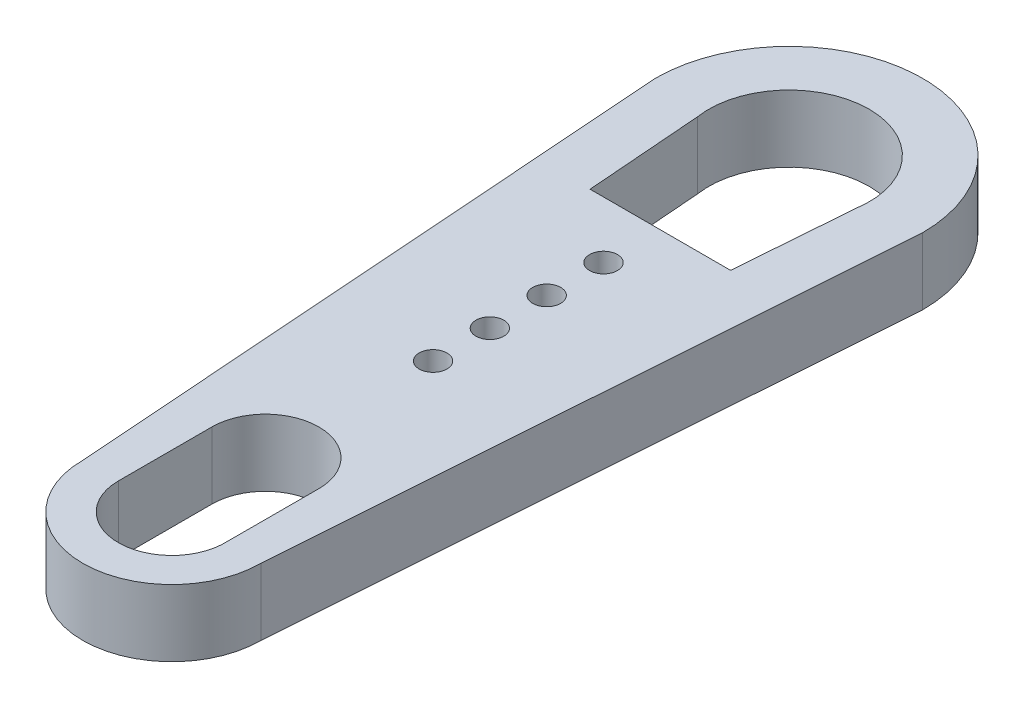
ISO-10303-21;
HEADER;
FILE_DESCRIPTION(('STEP AP214'),'2;1');
FILE_NAME('part.step','',(''),(''),'','','');
FILE_SCHEMA(('AUTOMOTIVE_DESIGN { 1 0 10303 214 1 1 1 1 }'));
ENDSEC;
DATA;
#1=APPLICATION_CONTEXT('core data for automotive mechanical design processes');
#2=APPLICATION_PROTOCOL_DEFINITION('international standard','automotive_design',2000,#1);
#3=PRODUCT_CONTEXT('',#1,'mechanical');
#4=PRODUCT('Part','Part','',(#3));
#5=PRODUCT_RELATED_PRODUCT_CATEGORY('part','',(#4));
#6=PRODUCT_DEFINITION_FORMATION('','',#4);
#7=PRODUCT_DEFINITION_CONTEXT('part definition',#1,'design');
#8=PRODUCT_DEFINITION('design','',#6,#7);
#9=PRODUCT_DEFINITION_SHAPE('','',#8);
#10=(LENGTH_UNIT() NAMED_UNIT(*) SI_UNIT(.MILLI.,.METRE.));
#11=(NAMED_UNIT(*) PLANE_ANGLE_UNIT() SI_UNIT($,.RADIAN.));
#12=(NAMED_UNIT(*) SI_UNIT($,.STERADIAN.) SOLID_ANGLE_UNIT());
#13=UNCERTAINTY_MEASURE_WITH_UNIT(LENGTH_MEASURE(1.E-05),#10,'distance_accuracy_value','');
#14=(GEOMETRIC_REPRESENTATION_CONTEXT(3) GLOBAL_UNCERTAINTY_ASSIGNED_CONTEXT((#13)) GLOBAL_UNIT_ASSIGNED_CONTEXT((#10,
#11,#12)) REPRESENTATION_CONTEXT('',''));
#15=CARTESIAN_POINT('',(0.,0.,0.));
#16=DIRECTION('',(0.,0.,1.));
#17=DIRECTION('',(1.,0.,0.));
#18=AXIS2_PLACEMENT_3D('',#15,#16,#17);
#19=CARTESIAN_POINT('',(0.530625446326115,3.,4.15892305549947));
#20=DIRECTION('',(0.,-1.,0.));
#21=DIRECTION('',(0.,0.,-1.));
#22=AXIS2_PLACEMENT_3D('',#19,#20,#21);
#23=CYLINDRICAL_SURFACE('',#22,2.4);
#24=CARTESIAN_POINT('',(0.530625446326115,0.,4.15892305549947));
#25=DIRECTION('',(0.,1.,0.));
#26=DIRECTION('',(0.,0.,1.));
#27=AXIS2_PLACEMENT_3D('',#24,#25,#26);
#28=CIRCLE('',#27,2.4);
#29=CARTESIAN_POINT('',(-1.86937455367389,0.,4.15892305549947));
#30=VERTEX_POINT('',#29);
#31=CARTESIAN_POINT('',(2.92734340542614,0.,4.0334518455452));
#32=VERTEX_POINT('',#31);
#33=EDGE_CURVE('E196',#30,#32,#28,.T.);
#34=ORIENTED_EDGE('',*,*,#33,.F.);
#35=DIRECTION('',(0.,-1.,0.));
#36=VECTOR('',#35,1.);
#37=CARTESIAN_POINT('',(-1.86937455367389,3.,4.15892305549947));
#38=LINE('',#37,#36);
#39=CARTESIAN_POINT('',(-1.86937455367389,3.,4.15892305549947));
#40=VERTEX_POINT('',#39);
#41=EDGE_CURVE('E11',#40,#30,#38,.T.);
#42=ORIENTED_EDGE('',*,*,#41,.F.);
#43=CARTESIAN_POINT('',(0.530625446326115,3.,4.15892305549947));
#44=DIRECTION('',(0.,1.,0.));
#45=DIRECTION('',(0.,0.,1.));
#46=AXIS2_PLACEMENT_3D('',#43,#44,#45);
#47=CIRCLE('',#46,2.4);
#48=CARTESIAN_POINT('',(2.92734340542614,3.,4.0334518455452));
#49=VERTEX_POINT('',#48);
#50=EDGE_CURVE('E153',#40,#49,#47,.T.);
#51=ORIENTED_EDGE('',*,*,#50,.T.);
#52=DIRECTION('',(0.,-1.,0.));
#53=VECTOR('',#52,1.);
#54=CARTESIAN_POINT('',(2.92734340542614,3.,4.0334518455452));
#55=LINE('',#54,#53);
#56=EDGE_CURVE('E106',#49,#32,#55,.T.);
#57=ORIENTED_EDGE('',*,*,#56,.T.);
#58=EDGE_LOOP('',(#34,#42,#51,#57));
#59=FACE_BOUND('',#58,.T.);
#60=ADVANCED_FACE('F41',(#59),#23,.F.);
#61=CARTESIAN_POINT('',(-1.86937455367389,3.,0.));
#62=DIRECTION('',(1.,0.,0.));
#63=DIRECTION('',(0.,0.,-1.));
#64=AXIS2_PLACEMENT_3D('',#61,#62,#63);
#65=PLANE('',#64);
#66=DIRECTION('',(0.,0.,1.));
#67=VECTOR('',#66,1.);
#68=CARTESIAN_POINT('',(-1.86937455367389,0.,0.));
#69=LINE('',#68,#67);
#70=CARTESIAN_POINT('',(-1.86937455367389,0.,-0.0410769445005307));
#71=VERTEX_POINT('',#70);
#72=EDGE_CURVE('E145',#71,#30,#69,.T.);
#73=ORIENTED_EDGE('',*,*,#72,.F.);
#74=DIRECTION('',(0.,-1.,0.));
#75=VECTOR('',#74,1.);
#76=CARTESIAN_POINT('',(-1.86937455367389,3.,-0.0410769445005307));
#77=LINE('',#76,#75);
#78=CARTESIAN_POINT('',(-1.86937455367389,3.,-0.0410769445005307));
#79=VERTEX_POINT('',#78);
#80=EDGE_CURVE('E51',#79,#71,#77,.T.);
#81=ORIENTED_EDGE('',*,*,#80,.F.);
#82=DIRECTION('',(0.,0.,1.));
#83=VECTOR('',#82,1.);
#84=CARTESIAN_POINT('',(-1.86937455367389,3.,0.));
#85=LINE('',#84,#83);
#86=EDGE_CURVE('E143',#79,#40,#85,.T.);
#87=ORIENTED_EDGE('',*,*,#86,.T.);
#88=ORIENTED_EDGE('',*,*,#41,.T.);
#89=EDGE_LOOP('',(#73,#81,#87,#88));
#90=FACE_BOUND('',#89,.T.);
#91=ADVANCED_FACE('F142',(#90),#65,.T.);
#92=CARTESIAN_POINT('',(0.530625446326113,3.,-0.0410769445005307));
#93=DIRECTION('',(0.,-1.,0.));
#94=DIRECTION('',(0.,0.,-1.));
#95=AXIS2_PLACEMENT_3D('',#92,#93,#94);
#96=CYLINDRICAL_SURFACE('',#95,2.4);
#97=CARTESIAN_POINT('',(0.530625446326113,0.,-0.0410769445005307));
#98=DIRECTION('',(0.,1.,0.));
#99=DIRECTION('',(0.,0.,1.));
#100=AXIS2_PLACEMENT_3D('',#97,#98,#99);
#101=CIRCLE('',#100,2.4);
#102=CARTESIAN_POINT('',(2.93062544632611,0.,-0.0410769445005307));
#103=VERTEX_POINT('',#102);
#104=EDGE_CURVE('E200',#103,#71,#101,.T.);
#105=ORIENTED_EDGE('',*,*,#104,.F.);
#106=DIRECTION('',(0.,-1.,0.));
#107=VECTOR('',#106,1.);
#108=CARTESIAN_POINT('',(2.93062544632611,3.,-0.0410769445005307));
#109=LINE('',#108,#107);
#110=CARTESIAN_POINT('',(2.93062544632611,3.,-0.0410769445005307));
#111=VERTEX_POINT('',#110);
#112=EDGE_CURVE('E99',#111,#103,#109,.T.);
#113=ORIENTED_EDGE('',*,*,#112,.F.);
#114=CARTESIAN_POINT('',(0.530625446326113,3.,-0.0410769445005307));
#115=DIRECTION('',(0.,1.,0.));
#116=DIRECTION('',(0.,0.,1.));
#117=AXIS2_PLACEMENT_3D('',#114,#115,#116);
#118=CIRCLE('',#117,2.4);
#119=EDGE_CURVE('E152',#111,#79,#118,.T.);
#120=ORIENTED_EDGE('',*,*,#119,.T.);
#121=ORIENTED_EDGE('',*,*,#80,.T.);
#122=EDGE_LOOP('',(#105,#113,#120,#121));
#123=FACE_BOUND('',#122,.T.);
#124=ADVANCED_FACE('F155',(#123),#96,.F.);
#125=CARTESIAN_POINT('',(-3.75010792122691,3.,0.27076591489003));
#126=DIRECTION('',(0.997403570895242,0.,-0.0720146982595844));
#127=DIRECTION('',(-0.0720146982595844,0.,-0.997403570895243));
#128=AXIS2_PLACEMENT_3D('',#125,#126,#127);
#129=PLANE('',#128);
#130=DIRECTION('',(0.0720146982595844,0.,0.997403570895243));
#131=VECTOR('',#130,1.);
#132=CARTESIAN_POINT('',(-3.75010792122691,0.,0.27076591489003));
#133=LINE('',#132,#131);
#134=CARTESIAN_POINT('',(-5.46937455367389,0.,-23.5410769445006));
#135=VERTEX_POINT('',#134);
#136=CARTESIAN_POINT('',(-3.46937455367389,0.,4.15892305549947));
#137=VERTEX_POINT('',#136);
#138=EDGE_CURVE('E185',#135,#137,#133,.T.);
#139=ORIENTED_EDGE('',*,*,#138,.T.);
#140=DIRECTION('',(0.,-1.,0.));
#141=VECTOR('',#140,1.);
#142=CARTESIAN_POINT('',(-3.46937455367389,3.,4.15892305549947));
#143=LINE('',#142,#141);
#144=CARTESIAN_POINT('',(-3.46937455367389,3.,4.15892305549947));
#145=VERTEX_POINT('',#144);
#146=EDGE_CURVE('E206',#145,#137,#143,.T.);
#147=ORIENTED_EDGE('',*,*,#146,.F.);
#148=DIRECTION('',(0.0720146982595844,0.,0.997403570895243));
#149=VECTOR('',#148,1.);
#150=CARTESIAN_POINT('',(-3.75010792122691,3.,0.27076591489003));
#151=LINE('',#150,#149);
#152=CARTESIAN_POINT('',(-5.46937455367389,3.,-23.5410769445006));
#153=VERTEX_POINT('',#152);
#154=EDGE_CURVE('E487',#153,#145,#151,.T.);
#155=ORIENTED_EDGE('',*,*,#154,.F.);
#156=DIRECTION('',(0.,-1.,0.));
#157=VECTOR('',#156,1.);
#158=CARTESIAN_POINT('',(-5.46937455367389,3.,-23.5410769445006));
#159=LINE('',#158,#157);
#160=EDGE_CURVE('E208',#153,#135,#159,.T.);
#161=ORIENTED_EDGE('',*,*,#160,.T.);
#162=EDGE_LOOP('',(#139,#147,#155,#161));
#163=FACE_BOUND('',#162,.T.);
#164=ADVANCED_FACE('F266',(#163),#129,.F.);
#165=CARTESIAN_POINT('',(0.530625446326115,3.,4.15892305549947));
#166=DIRECTION('',(0.,-1.,0.));
#167=DIRECTION('',(0.,0.,-1.));
#168=AXIS2_PLACEMENT_3D('',#165,#166,#167);
#169=CYLINDRICAL_SURFACE('',#168,4.);
#170=CARTESIAN_POINT('',(0.530625446326115,0.,4.15892305549947));
#171=DIRECTION('',(0.,1.,0.));
#172=DIRECTION('',(0.,0.,1.));
#173=AXIS2_PLACEMENT_3D('',#170,#171,#172);
#174=CIRCLE('',#173,4.);
#175=CARTESIAN_POINT('',(4.53062544632612,0.,4.15892305549947));
#176=VERTEX_POINT('',#175);
#177=EDGE_CURVE('E188',#137,#176,#174,.T.);
#178=ORIENTED_EDGE('',*,*,#177,.T.);
#179=DIRECTION('',(0.,-1.,0.));
#180=VECTOR('',#179,1.);
#181=CARTESIAN_POINT('',(4.53062544632612,3.,4.15892305549947));
#182=LINE('',#181,#180);
#183=CARTESIAN_POINT('',(4.53062544632612,3.,4.15892305549947));
#184=VERTEX_POINT('',#183);
#185=EDGE_CURVE('E213',#184,#176,#182,.T.);
#186=ORIENTED_EDGE('',*,*,#185,.F.);
#187=CARTESIAN_POINT('',(0.530625446326115,3.,4.15892305549947));
#188=DIRECTION('',(0.,1.,0.));
#189=DIRECTION('',(0.,0.,1.));
#190=AXIS2_PLACEMENT_3D('',#187,#188,#189);
#191=CIRCLE('',#190,4.);
#192=EDGE_CURVE('E485',#145,#184,#191,.T.);
#193=ORIENTED_EDGE('',*,*,#192,.F.);
#194=ORIENTED_EDGE('',*,*,#146,.T.);
#195=EDGE_LOOP('',(#178,#186,#193,#194));
#196=FACE_BOUND('',#195,.T.);
#197=ADVANCED_FACE('F262',(#196),#169,.T.);
#198=CARTESIAN_POINT('',(4.80585504283244,3.,0.346993143886818));
#199=DIRECTION('',(0.997403570895242,0.,0.0720146982595841));
#200=DIRECTION('',(0.0720146982595841,0.,-0.997403570895243));
#201=AXIS2_PLACEMENT_3D('',#198,#199,#200);
#202=PLANE('',#201);
#203=DIRECTION('',(-0.0720146982595841,0.,0.997403570895243));
#204=VECTOR('',#203,1.);
#205=CARTESIAN_POINT('',(4.80585504283244,0.,0.346993143886818));
#206=LINE('',#205,#204);
#207=CARTESIAN_POINT('',(6.53062544632611,0.,-23.5410769445006));
#208=VERTEX_POINT('',#207);
#209=EDGE_CURVE('E191',#208,#176,#206,.T.);
#210=ORIENTED_EDGE('',*,*,#209,.F.);
#211=DIRECTION('',(0.,-1.,0.));
#212=VECTOR('',#211,1.);
#213=CARTESIAN_POINT('',(6.53062544632611,3.,-23.5410769445006));
#214=LINE('',#213,#212);
#215=CARTESIAN_POINT('',(6.53062544632611,3.,-23.5410769445006));
#216=VERTEX_POINT('',#215);
#217=EDGE_CURVE('E211',#216,#208,#214,.T.);
#218=ORIENTED_EDGE('',*,*,#217,.F.);
#219=DIRECTION('',(-0.0720146982595841,0.,0.997403570895243));
#220=VECTOR('',#219,1.);
#221=CARTESIAN_POINT('',(4.80585504283244,3.,0.346993143886818));
#222=LINE('',#221,#220);
#223=EDGE_CURVE('E480',#216,#184,#222,.T.);
#224=ORIENTED_EDGE('',*,*,#223,.T.);
#225=ORIENTED_EDGE('',*,*,#185,.T.);
#226=EDGE_LOOP('',(#210,#218,#224,#225));
#227=FACE_BOUND('',#226,.T.);
#228=ADVANCED_FACE('F259',(#227),#202,.T.);
#229=CARTESIAN_POINT('',(0.,3.,-17.7660769445005));
#230=DIRECTION('',(0.,0.,-1.));
#231=DIRECTION('',(-1.,0.,0.));
#232=AXIS2_PLACEMENT_3D('',#229,#230,#231);
#233=PLANE('',#232);
#234=DIRECTION('',(1.,0.,0.));
#235=VECTOR('',#234,1.);
#236=CARTESIAN_POINT('',(0.,0.,-17.7660769445005));
#237=LINE('',#236,#235);
#238=CARTESIAN_POINT('',(-2.62227777948034,0.,-17.7660769445005));
#239=VERTEX_POINT('',#238);
#240=CARTESIAN_POINT('',(3.68352867213256,0.,-17.7660769445005));
#241=VERTEX_POINT('',#240);
#242=EDGE_CURVE('E161',#239,#241,#237,.T.);
#243=ORIENTED_EDGE('',*,*,#242,.F.);
#244=DIRECTION('',(0.,-1.,0.));
#245=VECTOR('',#244,1.);
#246=CARTESIAN_POINT('',(-2.62227777948034,3.,-17.7660769445005));
#247=LINE('',#246,#245);
#248=CARTESIAN_POINT('',(-2.62227777948034,3.,-17.7660769445005));
#249=VERTEX_POINT('',#248);
#250=EDGE_CURVE('E45',#249,#239,#247,.T.);
#251=ORIENTED_EDGE('',*,*,#250,.F.);
#252=DIRECTION('',(1.,0.,0.));
#253=VECTOR('',#252,1.);
#254=CARTESIAN_POINT('',(0.,3.,-17.7660769445005));
#255=LINE('',#254,#253);
#256=CARTESIAN_POINT('',(3.68352867213256,3.,-17.7660769445005));
#257=VERTEX_POINT('',#256);
#258=EDGE_CURVE('E204',#249,#257,#255,.T.);
#259=ORIENTED_EDGE('',*,*,#258,.T.);
#260=DIRECTION('',(0.,-1.,0.));
#261=VECTOR('',#260,1.);
#262=CARTESIAN_POINT('',(3.68352867213256,3.,-17.7660769445005));
#263=LINE('',#262,#261);
#264=EDGE_CURVE('E157',#257,#241,#263,.T.);
#265=ORIENTED_EDGE('',*,*,#264,.T.);
#266=EDGE_LOOP('',(#243,#251,#259,#265));
#267=FACE_BOUND('',#266,.T.);
#268=ADVANCED_FACE('F43',(#267),#233,.T.);
#269=CARTESIAN_POINT('',(-1.23941083765336,3.,0.0959543874312282));
#270=DIRECTION('',(-0.997016526728571,0.,0.0771883762628575));
#271=DIRECTION('',(0.0771883762628576,0.,0.997016526728571));
#272=AXIS2_PLACEMENT_3D('',#269,#270,#271);
#273=PLANE('',#272);
#274=DIRECTION('',(-0.0771883762628575,0.,-0.997016526728571));
#275=VECTOR('',#274,1.);
#276=CARTESIAN_POINT('',(-1.23941083765336,0.,0.0959543874312282));
#277=LINE('',#276,#275);
#278=CARTESIAN_POINT('',(-3.0264766265772,0.,-22.9869787195016));
#279=VERTEX_POINT('',#278);
#280=EDGE_CURVE('E164',#239,#279,#277,.T.);
#281=ORIENTED_EDGE('',*,*,#280,.T.);
#282=DIRECTION('',(0.,-1.,0.));
#283=VECTOR('',#282,1.);
#284=CARTESIAN_POINT('',(-3.0264766265772,3.,-22.9869787195016));
#285=LINE('',#284,#283);
#286=CARTESIAN_POINT('',(-3.0264766265772,3.,-22.9869787195016));
#287=VERTEX_POINT('',#286);
#288=EDGE_CURVE('E219',#287,#279,#285,.T.);
#289=ORIENTED_EDGE('',*,*,#288,.F.);
#290=DIRECTION('',(-0.0771883762628575,0.,-0.997016526728571));
#291=VECTOR('',#290,1.);
#292=CARTESIAN_POINT('',(-1.23941083765336,3.,0.0959543874312282));
#293=LINE('',#292,#291);
#294=EDGE_CURVE('E227',#249,#287,#293,.T.);
#295=ORIENTED_EDGE('',*,*,#294,.F.);
#296=ORIENTED_EDGE('',*,*,#250,.T.);
#297=EDGE_LOOP('',(#281,#289,#295,#296));
#298=FACE_BOUND('',#297,.T.);
#299=ADVANCED_FACE('F226',(#298),#273,.F.);
#300=CARTESIAN_POINT('',(0.530625446326111,3.,-23.5410769445005));
#301=DIRECTION('',(0.,-1.,0.));
#302=DIRECTION('',(0.,0.,-1.));
#303=AXIS2_PLACEMENT_3D('',#300,#301,#302);
#304=CYLINDRICAL_SURFACE('',#303,3.6);
#305=CARTESIAN_POINT('',(0.530625446326111,0.,-23.5410769445005));
#306=DIRECTION('',(0.,1.,0.));
#307=DIRECTION('',(0.,0.,1.));
#308=AXIS2_PLACEMENT_3D('',#305,#306,#307);
#309=CIRCLE('',#308,3.6);
#310=CARTESIAN_POINT('',(4.08772751922942,0.,-22.9869787195015));
#311=VERTEX_POINT('',#310);
#312=EDGE_CURVE('E167',#311,#279,#309,.T.);
#313=ORIENTED_EDGE('',*,*,#312,.F.);
#314=DIRECTION('',(0.,-1.,0.));
#315=VECTOR('',#314,1.);
#316=CARTESIAN_POINT('',(4.08772751922942,3.,-22.9869787195015));
#317=LINE('',#316,#315);
#318=CARTESIAN_POINT('',(4.08772751922942,3.,-22.9869787195015));
#319=VERTEX_POINT('',#318);
#320=EDGE_CURVE('E218',#319,#311,#317,.T.);
#321=ORIENTED_EDGE('',*,*,#320,.F.);
#322=CARTESIAN_POINT('',(0.530625446326111,3.,-23.5410769445005));
#323=DIRECTION('',(0.,1.,0.));
#324=DIRECTION('',(0.,0.,1.));
#325=AXIS2_PLACEMENT_3D('',#322,#323,#324);
#326=CIRCLE('',#325,3.6);
#327=EDGE_CURVE('E503',#319,#287,#326,.T.);
#328=ORIENTED_EDGE('',*,*,#327,.T.);
#329=ORIENTED_EDGE('',*,*,#288,.T.);
#330=EDGE_LOOP('',(#313,#321,#328,#329));
#331=FACE_BOUND('',#330,.T.);
#332=ADVANCED_FACE('F239',(#331),#304,.F.);
#333=CARTESIAN_POINT('',(0.530625446326111,3.,-23.5410769445005));
#334=DIRECTION('',(0.,-1.,0.));
#335=DIRECTION('',(0.,0.,-1.));
#336=AXIS2_PLACEMENT_3D('',#333,#334,#335);
#337=CYLINDRICAL_SURFACE('',#336,6.);
#338=CARTESIAN_POINT('',(0.530625446326111,0.,-23.5410769445005));
#339=DIRECTION('',(0.,1.,0.));
#340=DIRECTION('',(0.,0.,1.));
#341=AXIS2_PLACEMENT_3D('',#338,#339,#340);
#342=CIRCLE('',#341,6.);
#343=EDGE_CURVE('E194',#208,#135,#342,.T.);
#344=ORIENTED_EDGE('',*,*,#343,.T.);
#345=ORIENTED_EDGE('',*,*,#160,.F.);
#346=CARTESIAN_POINT('',(0.530625446326111,3.,-23.5410769445005));
#347=DIRECTION('',(0.,1.,0.));
#348=DIRECTION('',(0.,0.,1.));
#349=AXIS2_PLACEMENT_3D('',#346,#347,#348);
#350=CIRCLE('',#349,6.);
#351=EDGE_CURVE('E479',#216,#153,#350,.T.);
#352=ORIENTED_EDGE('',*,*,#351,.F.);
#353=ORIENTED_EDGE('',*,*,#217,.T.);
#354=EDGE_LOOP('',(#344,#345,#352,#353));
#355=FACE_BOUND('',#354,.T.);
#356=ADVANCED_FACE('F241',(#355),#337,.T.);
#357=CARTESIAN_POINT('',(0.530625446326115,3.,-10.1160769445005));
#358=DIRECTION('',(0.,-1.,0.));
#359=DIRECTION('',(0.,0.,-1.));
#360=AXIS2_PLACEMENT_3D('',#357,#358,#359);
#361=CYLINDRICAL_SURFACE('',#360,0.625);
#362=CARTESIAN_POINT('',(0.530625446326115,3.,-10.1160769445005));
#363=DIRECTION('',(0.,1.,0.));
#364=DIRECTION('',(0.,0.,1.));
#365=AXIS2_PLACEMENT_3D('',#362,#363,#364);
#366=CIRCLE('',#365,0.625);
#367=CARTESIAN_POINT('',(0.530625446326115,3.,-9.49107694450053));
#368=VERTEX_POINT('',#367);
#369=EDGE_CURVE('E490',#368,#368,#366,.T.);
#370=ORIENTED_EDGE('',*,*,#369,.T.);
#371=EDGE_LOOP('',(#370));
#372=FACE_BOUND('',#371,.T.);
#373=CARTESIAN_POINT('',(0.530625446326115,0.,-10.1160769445005));
#374=DIRECTION('',(0.,1.,0.));
#375=DIRECTION('',(0.,0.,1.));
#376=AXIS2_PLACEMENT_3D('',#373,#374,#375);
#377=CIRCLE('',#376,0.625);
#378=CARTESIAN_POINT('',(0.530625446326115,0.,-9.49107694450053));
#379=VERTEX_POINT('',#378);
#380=EDGE_CURVE('E182',#379,#379,#377,.T.);
#381=ORIENTED_EDGE('',*,*,#380,.F.);
#382=EDGE_LOOP('',(#381));
#383=FACE_BOUND('',#382,.T.);
#384=ADVANCED_FACE('F247',(#372,#383),#361,.F.);
#385=CARTESIAN_POINT('',(0.530625446326115,3.,-12.6660769445005));
#386=DIRECTION('',(0.,-1.,0.));
#387=DIRECTION('',(0.,0.,-1.));
#388=AXIS2_PLACEMENT_3D('',#385,#386,#387);
#389=CYLINDRICAL_SURFACE('',#388,0.625);
#390=CARTESIAN_POINT('',(0.530625446326115,3.,-12.6660769445005));
#391=DIRECTION('',(0.,1.,0.));
#392=DIRECTION('',(0.,0.,1.));
#393=AXIS2_PLACEMENT_3D('',#390,#391,#392);
#394=CIRCLE('',#393,0.625);
#395=CARTESIAN_POINT('',(0.530625446326115,3.,-12.0410769445005));
#396=VERTEX_POINT('',#395);
#397=EDGE_CURVE('E493',#396,#396,#394,.T.);
#398=ORIENTED_EDGE('',*,*,#397,.T.);
#399=EDGE_LOOP('',(#398));
#400=FACE_BOUND('',#399,.T.);
#401=CARTESIAN_POINT('',(0.530625446326115,0.,-12.6660769445005));
#402=DIRECTION('',(0.,1.,0.));
#403=DIRECTION('',(0.,0.,1.));
#404=AXIS2_PLACEMENT_3D('',#401,#402,#403);
#405=CIRCLE('',#404,0.625);
#406=CARTESIAN_POINT('',(0.530625446326115,0.,-12.0410769445005));
#407=VERTEX_POINT('',#406);
#408=EDGE_CURVE('E179',#407,#407,#405,.T.);
#409=ORIENTED_EDGE('',*,*,#408,.F.);
#410=EDGE_LOOP('',(#409));
#411=FACE_BOUND('',#410,.T.);
#412=ADVANCED_FACE('F273',(#400,#411),#389,.F.);
#413=CARTESIAN_POINT('',(0.530625446326115,3.,-15.2160769445005));
#414=DIRECTION('',(0.,-1.,0.));
#415=DIRECTION('',(0.,0.,-1.));
#416=AXIS2_PLACEMENT_3D('',#413,#414,#415);
#417=CYLINDRICAL_SURFACE('',#416,0.624999999999997);
#418=CARTESIAN_POINT('',(0.530625446326115,3.,-15.2160769445005));
#419=DIRECTION('',(0.,1.,0.));
#420=DIRECTION('',(0.,0.,1.));
#421=AXIS2_PLACEMENT_3D('',#418,#419,#420);
#422=CIRCLE('',#421,0.624999999999997);
#423=CARTESIAN_POINT('',(0.530625446326115,3.,-14.5910769445005));
#424=VERTEX_POINT('',#423);
#425=EDGE_CURVE('E496',#424,#424,#422,.T.);
#426=ORIENTED_EDGE('',*,*,#425,.T.);
#427=EDGE_LOOP('',(#426));
#428=FACE_BOUND('',#427,.T.);
#429=CARTESIAN_POINT('',(0.530625446326115,0.,-15.2160769445005));
#430=DIRECTION('',(0.,1.,0.));
#431=DIRECTION('',(0.,0.,1.));
#432=AXIS2_PLACEMENT_3D('',#429,#430,#431);
#433=CIRCLE('',#432,0.624999999999997);
#434=CARTESIAN_POINT('',(0.530625446326115,0.,-14.5910769445005));
#435=VERTEX_POINT('',#434);
#436=EDGE_CURVE('E176',#435,#435,#433,.T.);
#437=ORIENTED_EDGE('',*,*,#436,.F.);
#438=EDGE_LOOP('',(#437));
#439=FACE_BOUND('',#438,.T.);
#440=ADVANCED_FACE('F277',(#428,#439),#417,.F.);
#441=CARTESIAN_POINT('',(0.530625446326115,3.,-7.56607694450053));
#442=DIRECTION('',(0.,-1.,0.));
#443=DIRECTION('',(0.,0.,-1.));
#444=AXIS2_PLACEMENT_3D('',#441,#442,#443);
#445=CYLINDRICAL_SURFACE('',#444,0.625);
#446=CARTESIAN_POINT('',(0.530625446326115,3.,-7.56607694450053));
#447=DIRECTION('',(0.,1.,0.));
#448=DIRECTION('',(0.,0.,1.));
#449=AXIS2_PLACEMENT_3D('',#446,#447,#448);
#450=CIRCLE('',#449,0.625);
#451=CARTESIAN_POINT('',(0.530625446326115,3.,-6.94107694450053));
#452=VERTEX_POINT('',#451);
#453=EDGE_CURVE('E499',#452,#452,#450,.T.);
#454=ORIENTED_EDGE('',*,*,#453,.T.);
#455=EDGE_LOOP('',(#454));
#456=FACE_BOUND('',#455,.T.);
#457=CARTESIAN_POINT('',(0.530625446326115,0.,-7.56607694450053));
#458=DIRECTION('',(0.,1.,0.));
#459=DIRECTION('',(0.,0.,1.));
#460=AXIS2_PLACEMENT_3D('',#457,#458,#459);
#461=CIRCLE('',#460,0.625);
#462=CARTESIAN_POINT('',(0.530625446326115,0.,-6.94107694450053));
#463=VERTEX_POINT('',#462);
#464=EDGE_CURVE('E173',#463,#463,#461,.T.);
#465=ORIENTED_EDGE('',*,*,#464,.F.);
#466=EDGE_LOOP('',(#465));
#467=FACE_BOUND('',#466,.T.);
#468=ADVANCED_FACE('F281',(#456,#467),#445,.F.);
#469=CARTESIAN_POINT('',(2.29433874927444,3.,0.177626225750279));
#470=DIRECTION('',(-0.997016526728571,0.,-0.0771883762628569));
#471=DIRECTION('',(-0.0771883762628569,0.,0.997016526728571));
#472=AXIS2_PLACEMENT_3D('',#469,#470,#471);
#473=PLANE('',#472);
#474=DIRECTION('',(0.0771883762628569,0.,-0.997016526728571));
#475=VECTOR('',#474,1.);
#476=CARTESIAN_POINT('',(2.29433874927444,0.,0.177626225750279));
#477=LINE('',#476,#475);
#478=EDGE_CURVE('E170',#241,#311,#477,.T.);
#479=ORIENTED_EDGE('',*,*,#478,.F.);
#480=ORIENTED_EDGE('',*,*,#264,.F.);
#481=DIRECTION('',(0.0771883762628569,0.,-0.997016526728571));
#482=VECTOR('',#481,1.);
#483=CARTESIAN_POINT('',(2.29433874927444,3.,0.177626225750279));
#484=LINE('',#483,#482);
#485=EDGE_CURVE('E237',#257,#319,#484,.T.);
#486=ORIENTED_EDGE('',*,*,#485,.T.);
#487=ORIENTED_EDGE('',*,*,#320,.T.);
#488=EDGE_LOOP('',(#479,#480,#486,#487));
#489=FACE_BOUND('',#488,.T.);
#490=ADVANCED_FACE('F236',(#489),#473,.T.);
#491=CARTESIAN_POINT('',(2.93059045730211,3.,0.0023605963382637));
#492=DIRECTION('',(0.999999675583459,0.,0.000805501692181294));
#493=DIRECTION('',(0.000805501692181294,0.,-0.999999675583459));
#494=AXIS2_PLACEMENT_3D('',#491,#492,#493);
#495=PLANE('',#494);
#496=DIRECTION('',(-0.000805501692181294,0.,0.999999675583459));
#497=VECTOR('',#496,1.);
#498=CARTESIAN_POINT('',(2.93059045730211,0.,0.0023605963382637));
#499=LINE('',#498,#497);
#500=EDGE_CURVE('E202',#103,#32,#499,.T.);
#501=ORIENTED_EDGE('',*,*,#500,.T.);
#502=ORIENTED_EDGE('',*,*,#56,.F.);
#503=DIRECTION('',(-0.000805501692181294,0.,0.999999675583459));
#504=VECTOR('',#503,1.);
#505=CARTESIAN_POINT('',(2.93059045730211,3.,0.0023605963382637));
#506=LINE('',#505,#504);
#507=EDGE_CURVE('E60',#111,#49,#506,.T.);
#508=ORIENTED_EDGE('',*,*,#507,.F.);
#509=ORIENTED_EDGE('',*,*,#112,.T.);
#510=EDGE_LOOP('',(#501,#502,#508,#509));
#511=FACE_BOUND('',#510,.T.);
#512=ADVANCED_FACE('F286',(#511),#495,.F.);
#513=CARTESIAN_POINT('',(0.,3.,0.));
#514=DIRECTION('',(0.,1.,0.));
#515=DIRECTION('',(0.,0.,1.));
#516=AXIS2_PLACEMENT_3D('',#513,#514,#515);
#517=PLANE('',#516);
#518=ORIENTED_EDGE('',*,*,#258,.F.);
#519=ORIENTED_EDGE('',*,*,#294,.T.);
#520=ORIENTED_EDGE('',*,*,#327,.F.);
#521=ORIENTED_EDGE('',*,*,#485,.F.);
#522=EDGE_LOOP('',(#518,#519,#520,#521));
#523=FACE_BOUND('',#522,.T.);
#524=ORIENTED_EDGE('',*,*,#453,.F.);
#525=EDGE_LOOP('',(#524));
#526=FACE_BOUND('',#525,.T.);
#527=ORIENTED_EDGE('',*,*,#425,.F.);
#528=EDGE_LOOP('',(#527));
#529=FACE_BOUND('',#528,.T.);
#530=ORIENTED_EDGE('',*,*,#397,.F.);
#531=EDGE_LOOP('',(#530));
#532=FACE_BOUND('',#531,.T.);
#533=ORIENTED_EDGE('',*,*,#369,.F.);
#534=EDGE_LOOP('',(#533));
#535=FACE_BOUND('',#534,.T.);
#536=ORIENTED_EDGE('',*,*,#154,.T.);
#537=ORIENTED_EDGE('',*,*,#192,.T.);
#538=ORIENTED_EDGE('',*,*,#223,.F.);
#539=ORIENTED_EDGE('',*,*,#351,.T.);
#540=EDGE_LOOP('',(#536,#537,#538,#539));
#541=FACE_BOUND('',#540,.T.);
#542=ORIENTED_EDGE('',*,*,#50,.F.);
#543=ORIENTED_EDGE('',*,*,#86,.F.);
#544=ORIENTED_EDGE('',*,*,#119,.F.);
#545=ORIENTED_EDGE('',*,*,#507,.T.);
#546=EDGE_LOOP('',(#542,#543,#544,#545));
#547=FACE_BOUND('',#546,.T.);
#548=ADVANCED_FACE('F151',(#523,#526,#529,#532,#535,#541,#547),#517,.T.);
#549=CARTESIAN_POINT('',(0.,0.,0.));
#550=DIRECTION('',(0.,1.,0.));
#551=DIRECTION('',(0.,0.,1.));
#552=AXIS2_PLACEMENT_3D('',#549,#550,#551);
#553=PLANE('',#552);
#554=ORIENTED_EDGE('',*,*,#242,.T.);
#555=ORIENTED_EDGE('',*,*,#478,.T.);
#556=ORIENTED_EDGE('',*,*,#312,.T.);
#557=ORIENTED_EDGE('',*,*,#280,.F.);
#558=EDGE_LOOP('',(#554,#555,#556,#557));
#559=FACE_BOUND('',#558,.T.);
#560=ORIENTED_EDGE('',*,*,#464,.T.);
#561=EDGE_LOOP('',(#560));
#562=FACE_BOUND('',#561,.T.);
#563=ORIENTED_EDGE('',*,*,#436,.T.);
#564=EDGE_LOOP('',(#563));
#565=FACE_BOUND('',#564,.T.);
#566=ORIENTED_EDGE('',*,*,#408,.T.);
#567=EDGE_LOOP('',(#566));
#568=FACE_BOUND('',#567,.T.);
#569=ORIENTED_EDGE('',*,*,#380,.T.);
#570=EDGE_LOOP('',(#569));
#571=FACE_BOUND('',#570,.T.);
#572=ORIENTED_EDGE('',*,*,#138,.F.);
#573=ORIENTED_EDGE('',*,*,#343,.F.);
#574=ORIENTED_EDGE('',*,*,#209,.T.);
#575=ORIENTED_EDGE('',*,*,#177,.F.);
#576=EDGE_LOOP('',(#572,#573,#574,#575));
#577=FACE_BOUND('',#576,.T.);
#578=ORIENTED_EDGE('',*,*,#33,.T.);
#579=ORIENTED_EDGE('',*,*,#500,.F.);
#580=ORIENTED_EDGE('',*,*,#104,.T.);
#581=ORIENTED_EDGE('',*,*,#72,.T.);
#582=EDGE_LOOP('',(#578,#579,#580,#581));
#583=FACE_BOUND('',#582,.T.);
#584=ADVANCED_FACE('F230',(#559,#562,#565,#568,#571,#577,#583),#553,.F.);
#585=CLOSED_SHELL('',(#60,#91,#124,#164,#197,#228,#268,#299,#332,#356,#384,#412,#440,#468,#490,
#512,#548,#584));
#586=MANIFOLD_SOLID_BREP('B2',#585);
#587=ADVANCED_BREP_SHAPE_REPRESENTATION('',(#18,#586),#14);
#588=SHAPE_DEFINITION_REPRESENTATION(#9,#587);
ENDSEC;
END-ISO-10303-21;
